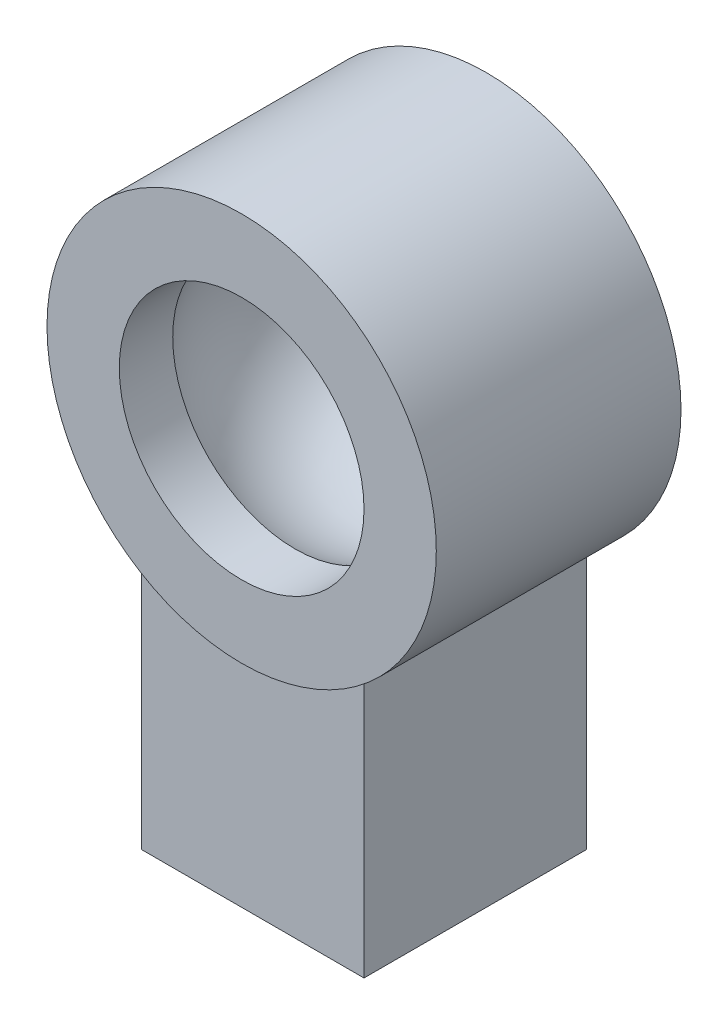
ISO-10303-21;
HEADER;
FILE_DESCRIPTION(('STEP AP214'),'2;1');
FILE_NAME('part.step','',(''),(''),'','','');
FILE_SCHEMA(('AUTOMOTIVE_DESIGN { 1 0 10303 214 1 1 1 1 }'));
ENDSEC;
DATA;
#1=APPLICATION_CONTEXT('core data for automotive mechanical design processes');
#2=APPLICATION_PROTOCOL_DEFINITION('international standard','automotive_design',2000,#1);
#3=PRODUCT_CONTEXT('',#1,'mechanical');
#4=PRODUCT('Part','Part','',(#3));
#5=PRODUCT_RELATED_PRODUCT_CATEGORY('part','',(#4));
#6=PRODUCT_DEFINITION_FORMATION('','',#4);
#7=PRODUCT_DEFINITION_CONTEXT('part definition',#1,'design');
#8=PRODUCT_DEFINITION('design','',#6,#7);
#9=PRODUCT_DEFINITION_SHAPE('','',#8);
#10=(LENGTH_UNIT() NAMED_UNIT(*) SI_UNIT(.MILLI.,.METRE.));
#11=(NAMED_UNIT(*) PLANE_ANGLE_UNIT() SI_UNIT($,.RADIAN.));
#12=(NAMED_UNIT(*) SI_UNIT($,.STERADIAN.) SOLID_ANGLE_UNIT());
#13=UNCERTAINTY_MEASURE_WITH_UNIT(LENGTH_MEASURE(1.E-05),#10,'distance_accuracy_value','');
#14=(GEOMETRIC_REPRESENTATION_CONTEXT(3) GLOBAL_UNCERTAINTY_ASSIGNED_CONTEXT((#13)) GLOBAL_UNIT_ASSIGNED_CONTEXT((#10,
#11,#12)) REPRESENTATION_CONTEXT('',''));
#15=CARTESIAN_POINT('',(0.,0.,0.));
#16=DIRECTION('',(0.,0.,1.));
#17=DIRECTION('',(1.,0.,0.));
#18=AXIS2_PLACEMENT_3D('',#15,#16,#17);
#19=CARTESIAN_POINT('',(0.,0.,2.2));
#20=DIRECTION('',(0.,0.,-1.));
#21=DIRECTION('',(-1.,0.,0.));
#22=AXIS2_PLACEMENT_3D('',#19,#20,#21);
#23=CYLINDRICAL_SURFACE('',#22,2.2);
#24=CARTESIAN_POINT('',(0.,0.,-1.23920337313937));
#25=DIRECTION('',(0.,0.,1.));
#26=DIRECTION('',(1.,0.,0.));
#27=AXIS2_PLACEMENT_3D('',#24,#25,#26);
#28=CIRCLE('',#27,2.2);
#29=CARTESIAN_POINT('',(2.2,0.,-1.23920337313937));
#30=VERTEX_POINT('',#29);
#31=EDGE_CURVE('E44',#30,#30,#28,.F.);
#32=ORIENTED_EDGE('',*,*,#31,.F.);
#33=EDGE_LOOP('',(#32));
#34=FACE_BOUND('',#33,.T.);
#35=CARTESIAN_POINT('',(0.,0.,-2.2));
#36=DIRECTION('',(0.,0.,1.));
#37=DIRECTION('',(1.,0.,0.));
#38=AXIS2_PLACEMENT_3D('',#35,#36,#37);
#39=CIRCLE('',#38,2.2);
#40=CARTESIAN_POINT('',(2.2,0.,-2.2));
#41=VERTEX_POINT('',#40);
#42=EDGE_CURVE('E115',#41,#41,#39,.T.);
#43=ORIENTED_EDGE('',*,*,#42,.F.);
#44=EDGE_LOOP('',(#43));
#45=FACE_BOUND('',#44,.T.);
#46=ADVANCED_FACE('F41',(#34,#45),#23,.F.);
#47=CARTESIAN_POINT('',(0.,0.,2.2));
#48=DIRECTION('',(0.,0.,-1.));
#49=DIRECTION('',(-1.,0.,0.));
#50=AXIS2_PLACEMENT_3D('',#47,#48,#49);
#51=CYLINDRICAL_SURFACE('',#50,3.5);
#52=CARTESIAN_POINT('',(0.,0.,-2.2));
#53=DIRECTION('',(0.,0.,1.));
#54=DIRECTION('',(1.,0.,0.));
#55=AXIS2_PLACEMENT_3D('',#52,#53,#54);
#56=CIRCLE('',#55,3.5);
#57=CARTESIAN_POINT('',(3.5,0.,-2.2));
#58=VERTEX_POINT('',#57);
#59=EDGE_CURVE('E116',#58,#58,#56,.T.);
#60=ORIENTED_EDGE('',*,*,#59,.T.);
#61=EDGE_LOOP('',(#60));
#62=FACE_BOUND('',#61,.T.);
#63=CARTESIAN_POINT('',(0.,0.,2.2));
#64=DIRECTION('',(0.,0.,1.));
#65=DIRECTION('',(1.,0.,0.));
#66=AXIS2_PLACEMENT_3D('',#63,#64,#65);
#67=CIRCLE('',#66,3.5);
#68=CARTESIAN_POINT('',(3.5,0.,2.2));
#69=VERTEX_POINT('',#68);
#70=EDGE_CURVE('E117',#69,#69,#67,.T.);
#71=ORIENTED_EDGE('',*,*,#70,.F.);
#72=EDGE_LOOP('',(#71));
#73=FACE_BOUND('',#72,.T.);
#74=CARTESIAN_POINT('',(0.,0.,2.));
#75=DIRECTION('',(0.,0.,-1.));
#76=DIRECTION('',(-1.,0.,0.));
#77=AXIS2_PLACEMENT_3D('',#74,#75,#76);
#78=CIRCLE('',#77,3.5);
#79=CARTESIAN_POINT('',(2.,-2.87228132326901,2.));
#80=VERTEX_POINT('',#79);
#81=CARTESIAN_POINT('',(-2.,-2.87228132326901,2.));
#82=VERTEX_POINT('',#81);
#83=EDGE_CURVE('E86',#80,#82,#78,.T.);
#84=ORIENTED_EDGE('',*,*,#83,.F.);
#85=DIRECTION('',(0.,0.,-1.));
#86=VECTOR('',#85,1.);
#87=CARTESIAN_POINT('',(2.,-2.87228132326901,2.2));
#88=LINE('',#87,#86);
#89=CARTESIAN_POINT('',(2.,-2.87228132326901,-2.));
#90=VERTEX_POINT('',#89);
#91=EDGE_CURVE('E49',#90,#80,#88,.F.);
#92=ORIENTED_EDGE('',*,*,#91,.F.);
#93=CARTESIAN_POINT('',(0.,0.,-2.));
#94=DIRECTION('',(0.,0.,-1.));
#95=DIRECTION('',(-1.,0.,0.));
#96=AXIS2_PLACEMENT_3D('',#93,#94,#95);
#97=CIRCLE('',#96,3.5);
#98=CARTESIAN_POINT('',(-2.,-2.87228132326901,-2.));
#99=VERTEX_POINT('',#98);
#100=EDGE_CURVE('E104',#90,#99,#97,.T.);
#101=ORIENTED_EDGE('',*,*,#100,.T.);
#102=DIRECTION('',(0.,0.,-1.));
#103=VECTOR('',#102,1.);
#104=CARTESIAN_POINT('',(-2.,-2.87228132326901,2.2));
#105=LINE('',#104,#103);
#106=EDGE_CURVE('E11',#82,#99,#105,.T.);
#107=ORIENTED_EDGE('',*,*,#106,.F.);
#108=EDGE_LOOP('',(#84,#92,#101,#107));
#109=FACE_BOUND('',#108,.T.);
#110=ADVANCED_FACE('F43',(#62,#73,#109),#51,.T.);
#111=CARTESIAN_POINT('',(0.,0.,2.2));
#112=DIRECTION('',(0.,0.,1.));
#113=DIRECTION('',(1.,0.,0.));
#114=AXIS2_PLACEMENT_3D('',#111,#112,#113);
#115=PLANE('',#114);
#116=ORIENTED_EDGE('',*,*,#70,.T.);
#117=EDGE_LOOP('',(#116));
#118=FACE_BOUND('',#117,.T.);
#119=CARTESIAN_POINT('',(0.,0.,2.2));
#120=DIRECTION('',(0.,0.,1.));
#121=DIRECTION('',(1.,0.,0.));
#122=AXIS2_PLACEMENT_3D('',#119,#120,#121);
#123=CIRCLE('',#122,2.2);
#124=CARTESIAN_POINT('',(2.2,0.,2.2));
#125=VERTEX_POINT('',#124);
#126=EDGE_CURVE('E111',#125,#125,#123,.T.);
#127=ORIENTED_EDGE('',*,*,#126,.F.);
#128=EDGE_LOOP('',(#127));
#129=FACE_BOUND('',#128,.T.);
#130=ADVANCED_FACE('F163',(#118,#129),#115,.T.);
#131=CARTESIAN_POINT('',(0.,0.,-2.2));
#132=DIRECTION('',(0.,0.,1.));
#133=DIRECTION('',(1.,0.,0.));
#134=AXIS2_PLACEMENT_3D('',#131,#132,#133);
#135=PLANE('',#134);
#136=ORIENTED_EDGE('',*,*,#59,.F.);
#137=EDGE_LOOP('',(#136));
#138=FACE_BOUND('',#137,.T.);
#139=ORIENTED_EDGE('',*,*,#42,.T.);
#140=EDGE_LOOP('',(#139));
#141=FACE_BOUND('',#140,.T.);
#142=ADVANCED_FACE('F171',(#138,#141),#135,.F.);
#143=CARTESIAN_POINT('',(0.,0.,1.23920337313937));
#144=DIRECTION('',(0.,0.,-1.));
#145=DIRECTION('',(-1.,0.,0.));
#146=AXIS2_PLACEMENT_3D('',#143,#144,#145);
#147=CIRCLE('',#146,2.2);
#148=CARTESIAN_POINT('',(-2.2,0.,1.23920337313937));
#149=VERTEX_POINT('',#148);
#150=EDGE_CURVE('E122',#149,#149,#147,.F.);
#151=ORIENTED_EDGE('',*,*,#150,.F.);
#152=EDGE_LOOP('',(#151));
#153=FACE_BOUND('',#152,.T.);
#154=ORIENTED_EDGE('',*,*,#126,.T.);
#155=EDGE_LOOP('',(#154));
#156=FACE_BOUND('',#155,.T.);
#157=ADVANCED_FACE('F162',(#153,#156),#23,.F.);
#158=CARTESIAN_POINT('',(-2.,-7.5,2.));
#159=DIRECTION('',(1.,0.,0.));
#160=DIRECTION('',(0.,0.,-1.));
#161=AXIS2_PLACEMENT_3D('',#158,#159,#160);
#162=PLANE('',#161);
#163=DIRECTION('',(0.,-1.,0.));
#164=VECTOR('',#163,1.);
#165=CARTESIAN_POINT('',(-2.,-7.5,2.));
#166=LINE('',#165,#164);
#167=CARTESIAN_POINT('',(-2.,-7.5,2.));
#168=VERTEX_POINT('',#167);
#169=EDGE_CURVE('E81',#82,#168,#166,.T.);
#170=ORIENTED_EDGE('',*,*,#169,.F.);
#171=ORIENTED_EDGE('',*,*,#106,.T.);
#172=DIRECTION('',(0.,-1.,0.));
#173=VECTOR('',#172,1.);
#174=CARTESIAN_POINT('',(-2.,-7.5,-2.));
#175=LINE('',#174,#173);
#176=CARTESIAN_POINT('',(-2.,-7.5,-2.));
#177=VERTEX_POINT('',#176);
#178=EDGE_CURVE('E59',#99,#177,#175,.T.);
#179=ORIENTED_EDGE('',*,*,#178,.T.);
#180=DIRECTION('',(0.,0.,-1.));
#181=VECTOR('',#180,1.);
#182=CARTESIAN_POINT('',(-2.,-7.5,2.));
#183=LINE('',#182,#181);
#184=EDGE_CURVE('E99',#168,#177,#183,.T.);
#185=ORIENTED_EDGE('',*,*,#184,.F.);
#186=EDGE_LOOP('',(#170,#171,#179,#185));
#187=FACE_BOUND('',#186,.T.);
#188=ADVANCED_FACE('F103',(#187),#162,.F.);
#189=CARTESIAN_POINT('',(2.,-7.5,2.));
#190=DIRECTION('',(-1.,0.,0.));
#191=DIRECTION('',(0.,0.,1.));
#192=AXIS2_PLACEMENT_3D('',#189,#190,#191);
#193=PLANE('',#192);
#194=DIRECTION('',(0.,1.,0.));
#195=VECTOR('',#194,1.);
#196=CARTESIAN_POINT('',(2.,-7.5,-2.));
#197=LINE('',#196,#195);
#198=CARTESIAN_POINT('',(2.,-7.5,-2.));
#199=VERTEX_POINT('',#198);
#200=EDGE_CURVE('E93',#199,#90,#197,.T.);
#201=ORIENTED_EDGE('',*,*,#200,.T.);
#202=ORIENTED_EDGE('',*,*,#91,.T.);
#203=DIRECTION('',(0.,1.,0.));
#204=VECTOR('',#203,1.);
#205=CARTESIAN_POINT('',(2.,-7.5,2.));
#206=LINE('',#205,#204);
#207=CARTESIAN_POINT('',(2.,-7.5,2.));
#208=VERTEX_POINT('',#207);
#209=EDGE_CURVE('E102',#208,#80,#206,.T.);
#210=ORIENTED_EDGE('',*,*,#209,.F.);
#211=DIRECTION('',(0.,0.,-1.));
#212=VECTOR('',#211,1.);
#213=CARTESIAN_POINT('',(2.,-7.5,2.));
#214=LINE('',#213,#212);
#215=EDGE_CURVE('E100',#208,#199,#214,.T.);
#216=ORIENTED_EDGE('',*,*,#215,.T.);
#217=EDGE_LOOP('',(#201,#202,#210,#216));
#218=FACE_BOUND('',#217,.T.);
#219=ADVANCED_FACE('F145',(#218),#193,.F.);
#220=CARTESIAN_POINT('',(-2.,-7.5,2.));
#221=DIRECTION('',(0.,1.,0.));
#222=DIRECTION('',(0.,0.,1.));
#223=AXIS2_PLACEMENT_3D('',#220,#221,#222);
#224=PLANE('',#223);
#225=CARTESIAN_POINT('',(0.,-7.5,0.));
#226=DIRECTION('',(0.,-1.,0.));
#227=DIRECTION('',(0.,0.,-1.));
#228=AXIS2_PLACEMENT_3D('',#225,#226,#227);
#229=CIRCLE('',#228,1.05);
#230=CARTESIAN_POINT('',(0.,-7.5,-1.05));
#231=VERTEX_POINT('',#230);
#232=EDGE_CURVE('E132',#231,#231,#229,.T.);
#233=ORIENTED_EDGE('',*,*,#232,.F.);
#234=EDGE_LOOP('',(#233));
#235=FACE_BOUND('',#234,.T.);
#236=DIRECTION('',(1.,0.,0.));
#237=VECTOR('',#236,1.);
#238=CARTESIAN_POINT('',(-2.,-7.5,-2.));
#239=LINE('',#238,#237);
#240=EDGE_CURVE('E138',#177,#199,#239,.T.);
#241=ORIENTED_EDGE('',*,*,#240,.T.);
#242=ORIENTED_EDGE('',*,*,#215,.F.);
#243=DIRECTION('',(1.,0.,0.));
#244=VECTOR('',#243,1.);
#245=CARTESIAN_POINT('',(-2.,-7.5,2.));
#246=LINE('',#245,#244);
#247=EDGE_CURVE('E87',#168,#208,#246,.T.);
#248=ORIENTED_EDGE('',*,*,#247,.F.);
#249=ORIENTED_EDGE('',*,*,#184,.T.);
#250=EDGE_LOOP('',(#241,#242,#248,#249));
#251=FACE_BOUND('',#250,.T.);
#252=ADVANCED_FACE('F97',(#235,#251),#224,.F.);
#253=CARTESIAN_POINT('',(0.,0.,2.));
#254=DIRECTION('',(0.,0.,-1.));
#255=DIRECTION('',(-1.,0.,0.));
#256=AXIS2_PLACEMENT_3D('',#253,#254,#255);
#257=PLANE('',#256);
#258=ORIENTED_EDGE('',*,*,#209,.T.);
#259=ORIENTED_EDGE('',*,*,#83,.T.);
#260=ORIENTED_EDGE('',*,*,#169,.T.);
#261=ORIENTED_EDGE('',*,*,#247,.T.);
#262=EDGE_LOOP('',(#258,#259,#260,#261));
#263=FACE_BOUND('',#262,.T.);
#264=ADVANCED_FACE('F83',(#263),#257,.F.);
#265=CARTESIAN_POINT('',(0.,0.,-2.));
#266=DIRECTION('',(0.,0.,-1.));
#267=DIRECTION('',(-1.,0.,0.));
#268=AXIS2_PLACEMENT_3D('',#265,#266,#267);
#269=PLANE('',#268);
#270=ORIENTED_EDGE('',*,*,#100,.F.);
#271=ORIENTED_EDGE('',*,*,#200,.F.);
#272=ORIENTED_EDGE('',*,*,#240,.F.);
#273=ORIENTED_EDGE('',*,*,#178,.F.);
#274=EDGE_LOOP('',(#270,#271,#272,#273));
#275=FACE_BOUND('',#274,.T.);
#276=ADVANCED_FACE('F142',(#275),#269,.T.);
#277=CARTESIAN_POINT('',(0.,0.,0.));
#278=DIRECTION('',(0.,-1.,0.));
#279=DIRECTION('',(1.,0.,0.));
#280=AXIS2_PLACEMENT_3D('',#277,#278,#279);
#281=SPHERICAL_SURFACE('',#280,2.525);
#282=CARTESIAN_POINT('',(0.,0.,0.));
#283=DIRECTION('',(0.,0.,1.));
#284=DIRECTION('',(1.,0.,0.));
#285=AXIS2_PLACEMENT_3D('',#282,#283,#284);
#286=SPHERICAL_SURFACE('',#285,2.525);
#287=ORIENTED_EDGE('',*,*,#31,.T.);
#288=EDGE_LOOP('',(#287));
#289=FACE_BOUND('',#288,.T.);
#290=ORIENTED_EDGE('',*,*,#150,.T.);
#291=EDGE_LOOP('',(#290));
#292=FACE_BOUND('',#291,.T.);
#293=ADVANCED_FACE('F146',(#289,#292),#286,.F.);
#294=CARTESIAN_POINT('',(0.,-4.8,0.));
#295=DIRECTION('',(0.,-1.,0.));
#296=DIRECTION('',(0.,0.,-1.));
#297=AXIS2_PLACEMENT_3D('',#294,#295,#296);
#298=CYLINDRICAL_SURFACE('',#297,1.05);
#299=CARTESIAN_POINT('',(0.,-4.8,0.));
#300=DIRECTION('',(0.,-1.,0.));
#301=DIRECTION('',(0.,0.,-1.));
#302=AXIS2_PLACEMENT_3D('',#299,#300,#301);
#303=CIRCLE('',#302,1.05);
#304=CARTESIAN_POINT('',(0.,-4.8,-1.05));
#305=VERTEX_POINT('',#304);
#306=EDGE_CURVE('E126',#305,#305,#303,.T.);
#307=CARTESIAN_POINT('',(0.,-4.8,-1.05));
#308=CARTESIAN_POINT('',(0.,-4.828125,-1.05));
#309=CARTESIAN_POINT('',(0.,-4.85625,-1.05));
#310=CARTESIAN_POINT('',(0.,-4.9125,-1.05));
#311=CARTESIAN_POINT('',(0.,-4.940625,-1.05));
#312=CARTESIAN_POINT('',(0.,-4.996875,-1.05));
#313=CARTESIAN_POINT('',(0.,-5.025,-1.05));
#314=CARTESIAN_POINT('',(0.,-5.08125,-1.05));
#315=CARTESIAN_POINT('',(0.,-5.109375,-1.05));
#316=CARTESIAN_POINT('',(0.,-5.165625,-1.05));
#317=CARTESIAN_POINT('',(0.,-5.19375,-1.05));
#318=CARTESIAN_POINT('',(0.,-5.25,-1.05));
#319=CARTESIAN_POINT('',(0.,-5.278125,-1.05));
#320=CARTESIAN_POINT('',(0.,-5.334375,-1.05));
#321=CARTESIAN_POINT('',(0.,-5.3625,-1.05));
#322=CARTESIAN_POINT('',(0.,-5.41875,-1.05));
#323=CARTESIAN_POINT('',(0.,-5.446875,-1.05));
#324=CARTESIAN_POINT('',(0.,-5.503125,-1.05));
#325=CARTESIAN_POINT('',(0.,-5.53125,-1.05));
#326=CARTESIAN_POINT('',(0.,-5.5875,-1.05));
#327=CARTESIAN_POINT('',(0.,-5.615625,-1.05));
#328=CARTESIAN_POINT('',(0.,-5.671875,-1.05));
#329=CARTESIAN_POINT('',(0.,-5.7,-1.05));
#330=CARTESIAN_POINT('',(0.,-5.75625,-1.05));
#331=CARTESIAN_POINT('',(0.,-5.784375,-1.05));
#332=CARTESIAN_POINT('',(0.,-5.840625,-1.05));
#333=CARTESIAN_POINT('',(0.,-5.86875,-1.05));
#334=CARTESIAN_POINT('',(0.,-5.925,-1.05));
#335=CARTESIAN_POINT('',(0.,-5.953125,-1.05));
#336=CARTESIAN_POINT('',(0.,-6.009375,-1.05));
#337=CARTESIAN_POINT('',(0.,-6.0375,-1.05));
#338=CARTESIAN_POINT('',(0.,-6.09375,-1.05));
#339=CARTESIAN_POINT('',(0.,-6.121875,-1.05));
#340=CARTESIAN_POINT('',(0.,-6.178125,-1.05));
#341=CARTESIAN_POINT('',(0.,-6.20625,-1.05));
#342=CARTESIAN_POINT('',(0.,-6.2625,-1.05));
#343=CARTESIAN_POINT('',(0.,-6.290625,-1.05));
#344=CARTESIAN_POINT('',(0.,-6.346875,-1.05));
#345=CARTESIAN_POINT('',(0.,-6.375,-1.05));
#346=CARTESIAN_POINT('',(0.,-6.43125,-1.05));
#347=CARTESIAN_POINT('',(0.,-6.459375,-1.05));
#348=CARTESIAN_POINT('',(0.,-6.515625,-1.05));
#349=CARTESIAN_POINT('',(0.,-6.54375,-1.05));
#350=CARTESIAN_POINT('',(0.,-6.6,-1.05));
#351=CARTESIAN_POINT('',(0.,-6.628125,-1.05));
#352=CARTESIAN_POINT('',(0.,-6.684375,-1.05));
#353=CARTESIAN_POINT('',(0.,-6.7125,-1.05));
#354=CARTESIAN_POINT('',(0.,-6.76875,-1.05));
#355=CARTESIAN_POINT('',(0.,-6.796875,-1.05));
#356=CARTESIAN_POINT('',(0.,-6.853125,-1.05));
#357=CARTESIAN_POINT('',(0.,-6.88125,-1.05));
#358=CARTESIAN_POINT('',(0.,-6.9375,-1.05));
#359=CARTESIAN_POINT('',(0.,-6.965625,-1.05));
#360=CARTESIAN_POINT('',(0.,-7.021875,-1.05));
#361=CARTESIAN_POINT('',(0.,-7.05,-1.05));
#362=CARTESIAN_POINT('',(0.,-7.10625,-1.05));
#363=CARTESIAN_POINT('',(0.,-7.134375,-1.05));
#364=CARTESIAN_POINT('',(0.,-7.190625,-1.05));
#365=CARTESIAN_POINT('',(0.,-7.21875,-1.05));
#366=CARTESIAN_POINT('',(0.,-7.275,-1.05));
#367=CARTESIAN_POINT('',(0.,-7.303125,-1.05));
#368=CARTESIAN_POINT('',(0.,-7.359375,-1.05));
#369=CARTESIAN_POINT('',(0.,-7.3875,-1.05));
#370=CARTESIAN_POINT('',(0.,-7.44375,-1.05));
#371=CARTESIAN_POINT('',(0.,-7.471875,-1.05));
#372=CARTESIAN_POINT('',(0.,-7.5,-1.05));
#373=B_SPLINE_CURVE_WITH_KNOTS('',3,(#307,#308,#309,#310,#311,#312,#313,#314,#315,#316,#317,
#318,#319,#320,#321,#322,#323,#324,#325,#326,#327,#328,#329,#330,#331,#332,#333,#334,#335,#336,
#337,#338,#339,#340,#341,#342,#343,#344,#345,#346,#347,#348,#349,#350,#351,#352,#353,#354,#355,
#356,#357,#358,#359,#360,#361,#362,#363,#364,#365,#366,#367,#368,#369,#370,#371,#372),
.UNSPECIFIED.,.F.,.F.,(4,2,2,2,2,2,2,2,2,2,2,2,2,2,2,2,2,2,2,2,2,2,2,2,2,2,2,2,2,2,2,2,4),(0.,
0.0843749999999994,0.16875,0.253125,0.337499999999999,0.421875,0.50625,0.590625,
0.674999999999999,0.759375,0.84375,0.928124999999999,1.0125,1.096875,1.18125,1.265625,1.35,
1.434375,1.51875,1.603125,1.6875,1.771875,1.85625,1.940625,2.025,2.109375,2.19375,2.278125,
2.3625,2.446875,2.53125,2.615625,2.7),.UNSPECIFIED.);
#374=EDGE_CURVE('BSEAM153',#305,#231,#373,.T.);
#375=ORIENTED_EDGE('',*,*,#306,.F.);
#376=ORIENTED_EDGE('',*,*,#232,.T.);
#377=ORIENTED_EDGE('',*,*,#374,.T.);
#378=ORIENTED_EDGE('',*,*,#374,.F.);
#379=EDGE_LOOP('',(#375,#377,#376,#378));
#380=FACE_BOUND('',#379,.T.);
#381=ADVANCED_FACE('F153',(#380),#298,.F.);
#382=CARTESIAN_POINT('',(0.,-4.8,0.));
#383=DIRECTION('',(0.,-1.,0.));
#384=DIRECTION('',(0.,0.,-1.));
#385=AXIS2_PLACEMENT_3D('',#382,#383,#384);
#386=PLANE('',#385);
#387=ORIENTED_EDGE('',*,*,#306,.T.);
#388=EDGE_LOOP('',(#387));
#389=FACE_BOUND('',#388,.T.);
#390=ADVANCED_FACE('F214',(#389),#386,.T.);
#391=CLOSED_SHELL('',(#46,#110,#130,#142,#157,#188,#219,#252,#264,#276,#293,#381,#390));
#392=MANIFOLD_SOLID_BREP('B2',#391);
#393=ADVANCED_BREP_SHAPE_REPRESENTATION('',(#18,#392),#14);
#394=SHAPE_DEFINITION_REPRESENTATION(#9,#393);
ENDSEC;
END-ISO-10303-21;
